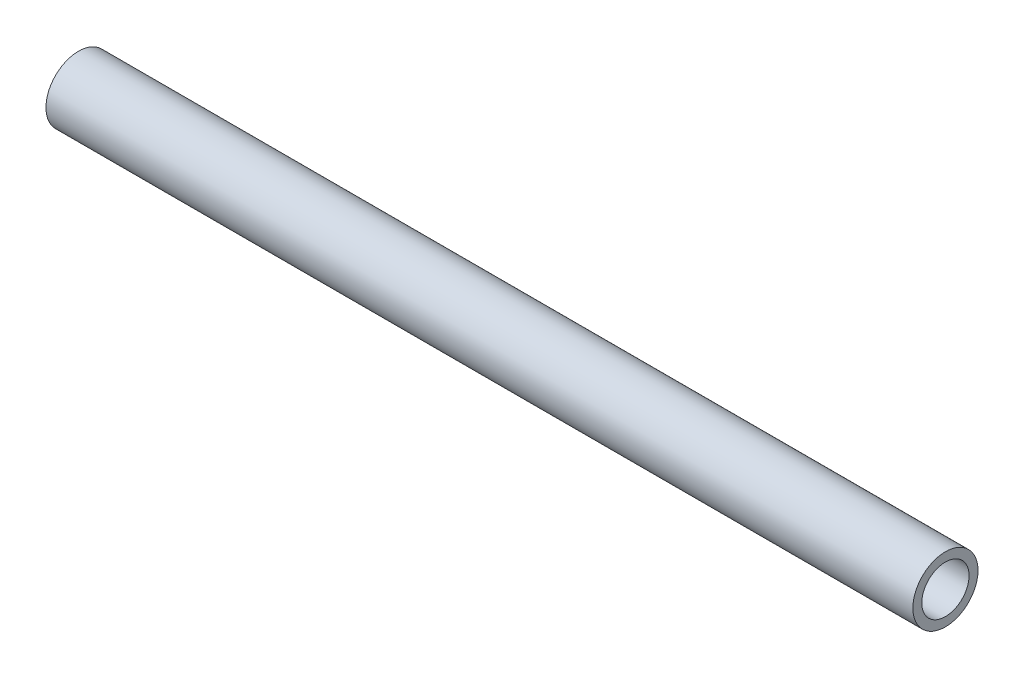
ISO-10303-21;
HEADER;
FILE_DESCRIPTION(('STEP AP214'),'2;1');
FILE_NAME('part.step','',(''),(''),'','','');
FILE_SCHEMA(('AUTOMOTIVE_DESIGN { 1 0 10303 214 1 1 1 1 }'));
ENDSEC;
DATA;
#1=APPLICATION_CONTEXT('core data for automotive mechanical design processes');
#2=APPLICATION_PROTOCOL_DEFINITION('international standard','automotive_design',2000,#1);
#3=PRODUCT_CONTEXT('',#1,'mechanical');
#4=PRODUCT('Part','Part','',(#3));
#5=PRODUCT_RELATED_PRODUCT_CATEGORY('part','',(#4));
#6=PRODUCT_DEFINITION_FORMATION('','',#4);
#7=PRODUCT_DEFINITION_CONTEXT('part definition',#1,'design');
#8=PRODUCT_DEFINITION('design','',#6,#7);
#9=PRODUCT_DEFINITION_SHAPE('','',#8);
#10=(LENGTH_UNIT() NAMED_UNIT(*) SI_UNIT(.MILLI.,.METRE.));
#11=(NAMED_UNIT(*) PLANE_ANGLE_UNIT() SI_UNIT($,.RADIAN.));
#12=(NAMED_UNIT(*) SI_UNIT($,.STERADIAN.) SOLID_ANGLE_UNIT());
#13=UNCERTAINTY_MEASURE_WITH_UNIT(LENGTH_MEASURE(1.E-05),#10,'distance_accuracy_value','');
#14=(GEOMETRIC_REPRESENTATION_CONTEXT(3) GLOBAL_UNCERTAINTY_ASSIGNED_CONTEXT((#13)) GLOBAL_UNIT_ASSIGNED_CONTEXT((#10,
#11,#12)) REPRESENTATION_CONTEXT('',''));
#15=CARTESIAN_POINT('',(0.,0.,0.));
#16=DIRECTION('',(0.,0.,1.));
#17=DIRECTION('',(1.,0.,0.));
#18=AXIS2_PLACEMENT_3D('',#15,#16,#17);
#19=CARTESIAN_POINT('',(350.,0.,0.));
#20=DIRECTION('',(1.,0.,0.));
#21=DIRECTION('',(0.,0.,-1.));
#22=AXIS2_PLACEMENT_3D('',#19,#20,#21);
#23=PLANE('',#22);
#24=CARTESIAN_POINT('',(350.,0.,0.));
#25=DIRECTION('',(1.,0.,0.));
#26=DIRECTION('',(0.,0.,-1.));
#27=AXIS2_PLACEMENT_3D('',#24,#25,#26);
#28=CIRCLE('',#27,13.15);
#29=CARTESIAN_POINT('',(350.,0.,-13.15));
#30=VERTEX_POINT('',#29);
#31=EDGE_CURVE('E10',#30,#30,#28,.T.);
#32=ORIENTED_EDGE('',*,*,#31,.T.);
#33=EDGE_LOOP('',(#32));
#34=FACE_BOUND('',#33,.T.);
#35=CARTESIAN_POINT('',(350.,0.,0.));
#36=DIRECTION('',(1.,0.,0.));
#37=DIRECTION('',(0.,0.,-1.));
#38=AXIS2_PLACEMENT_3D('',#35,#36,#37);
#39=CIRCLE('',#38,9.55);
#40=CARTESIAN_POINT('',(350.,0.,-9.55));
#41=VERTEX_POINT('',#40);
#42=EDGE_CURVE('E44',#41,#41,#39,.T.);
#43=ORIENTED_EDGE('',*,*,#42,.F.);
#44=EDGE_LOOP('',(#43));
#45=FACE_BOUND('',#44,.T.);
#46=ADVANCED_FACE('F33',(#34,#45),#23,.T.);
#47=CARTESIAN_POINT('',(0.,0.,0.));
#48=DIRECTION('',(1.,0.,0.));
#49=DIRECTION('',(0.,0.,-1.));
#50=AXIS2_PLACEMENT_3D('',#47,#48,#49);
#51=PLANE('',#50);
#52=CARTESIAN_POINT('',(0.,0.,0.));
#53=DIRECTION('',(1.,0.,0.));
#54=DIRECTION('',(0.,0.,-1.));
#55=AXIS2_PLACEMENT_3D('',#52,#53,#54);
#56=CIRCLE('',#55,13.15);
#57=CARTESIAN_POINT('',(0.,0.,-13.15));
#58=VERTEX_POINT('',#57);
#59=EDGE_CURVE('E37',#58,#58,#56,.T.);
#60=ORIENTED_EDGE('',*,*,#59,.F.);
#61=EDGE_LOOP('',(#60));
#62=FACE_BOUND('',#61,.T.);
#63=CARTESIAN_POINT('',(0.,0.,0.));
#64=DIRECTION('',(1.,0.,0.));
#65=DIRECTION('',(0.,0.,-1.));
#66=AXIS2_PLACEMENT_3D('',#63,#64,#65);
#67=CIRCLE('',#66,9.55);
#68=CARTESIAN_POINT('',(0.,0.,-9.55));
#69=VERTEX_POINT('',#68);
#70=EDGE_CURVE('E46',#69,#69,#67,.T.);
#71=ORIENTED_EDGE('',*,*,#70,.T.);
#72=EDGE_LOOP('',(#71));
#73=FACE_BOUND('',#72,.T.);
#74=ADVANCED_FACE('F56',(#62,#73),#51,.F.);
#75=CARTESIAN_POINT('',(350.,0.,0.));
#76=DIRECTION('',(-1.,0.,0.));
#77=DIRECTION('',(0.,0.,1.));
#78=AXIS2_PLACEMENT_3D('',#75,#76,#77);
#79=CYLINDRICAL_SURFACE('',#78,13.15);
#80=ORIENTED_EDGE('',*,*,#31,.F.);
#81=EDGE_LOOP('',(#80));
#82=FACE_BOUND('',#81,.T.);
#83=ORIENTED_EDGE('',*,*,#59,.T.);
#84=EDGE_LOOP('',(#83));
#85=FACE_BOUND('',#84,.T.);
#86=ADVANCED_FACE('F35',(#82,#85),#79,.T.);
#87=CARTESIAN_POINT('',(350.,0.,0.));
#88=DIRECTION('',(-1.,0.,0.));
#89=DIRECTION('',(0.,0.,1.));
#90=AXIS2_PLACEMENT_3D('',#87,#88,#89);
#91=CYLINDRICAL_SURFACE('',#90,9.55);
#92=ORIENTED_EDGE('',*,*,#42,.T.);
#93=EDGE_LOOP('',(#92));
#94=FACE_BOUND('',#93,.T.);
#95=ORIENTED_EDGE('',*,*,#70,.F.);
#96=EDGE_LOOP('',(#95));
#97=FACE_BOUND('',#96,.T.);
#98=ADVANCED_FACE('F52',(#94,#97),#91,.F.);
#99=CLOSED_SHELL('',(#46,#74,#86,#98));
#100=MANIFOLD_SOLID_BREP('B2',#99);
#101=ADVANCED_BREP_SHAPE_REPRESENTATION('',(#18,#100),#14);
#102=SHAPE_DEFINITION_REPRESENTATION(#9,#101);
ENDSEC;
END-ISO-10303-21;
